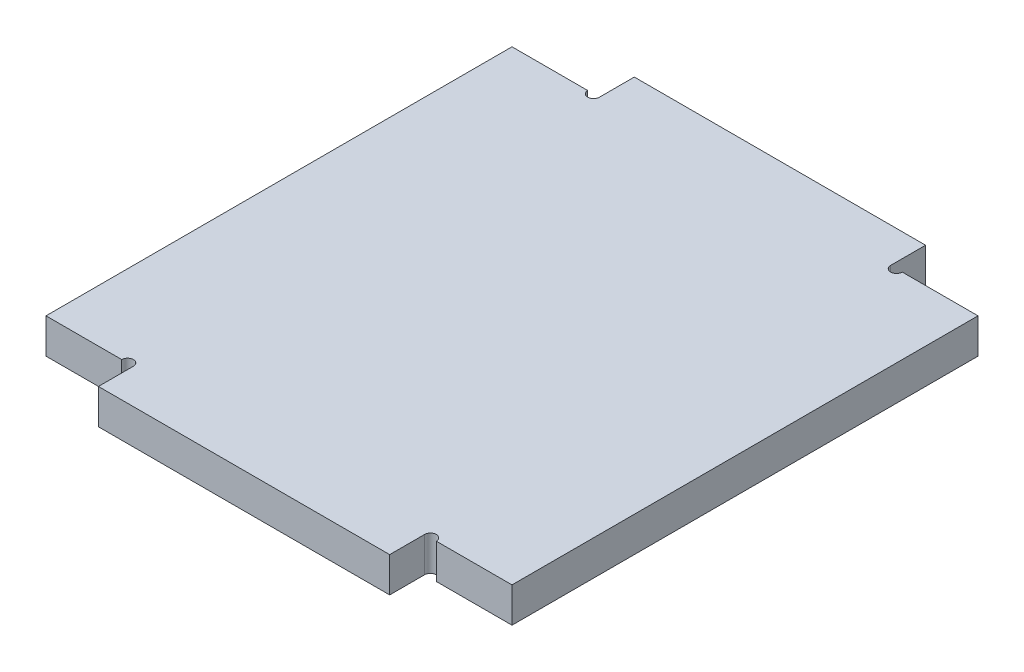
ISO-10303-21;
HEADER;
FILE_DESCRIPTION(('STEP AP214'),'2;1');
FILE_NAME('part.step','',(''),(''),'','','');
FILE_SCHEMA(('AUTOMOTIVE_DESIGN { 1 0 10303 214 1 1 1 1 }'));
ENDSEC;
DATA;
#1=APPLICATION_CONTEXT('core data for automotive mechanical design processes');
#2=APPLICATION_PROTOCOL_DEFINITION('international standard','automotive_design',2000,#1);
#3=PRODUCT_CONTEXT('',#1,'mechanical');
#4=PRODUCT('Part','Part','',(#3));
#5=PRODUCT_RELATED_PRODUCT_CATEGORY('part','',(#4));
#6=PRODUCT_DEFINITION_FORMATION('','',#4);
#7=PRODUCT_DEFINITION_CONTEXT('part definition',#1,'design');
#8=PRODUCT_DEFINITION('design','',#6,#7);
#9=PRODUCT_DEFINITION_SHAPE('','',#8);
#10=(LENGTH_UNIT() NAMED_UNIT(*) SI_UNIT(.MILLI.,.METRE.));
#11=(NAMED_UNIT(*) PLANE_ANGLE_UNIT() SI_UNIT($,.RADIAN.));
#12=(NAMED_UNIT(*) SI_UNIT($,.STERADIAN.) SOLID_ANGLE_UNIT());
#13=UNCERTAINTY_MEASURE_WITH_UNIT(LENGTH_MEASURE(1.E-05),#10,'distance_accuracy_value','');
#14=(GEOMETRIC_REPRESENTATION_CONTEXT(3) GLOBAL_UNCERTAINTY_ASSIGNED_CONTEXT((#13)) GLOBAL_UNIT_ASSIGNED_CONTEXT((#10,
#11,#12)) REPRESENTATION_CONTEXT('',''));
#15=CARTESIAN_POINT('',(0.,0.,0.));
#16=DIRECTION('',(0.,0.,1.));
#17=DIRECTION('',(1.,0.,0.));
#18=AXIS2_PLACEMENT_3D('',#15,#16,#17);
#19=CARTESIAN_POINT('',(0.,3.,0.));
#20=DIRECTION('',(1.,0.,0.));
#21=DIRECTION('',(0.,0.,-1.));
#22=AXIS2_PLACEMENT_3D('',#19,#20,#21);
#23=PLANE('',#22);
#24=DIRECTION('',(0.,0.,1.));
#25=VECTOR('',#24,1.);
#26=CARTESIAN_POINT('',(0.,0.,0.));
#27=LINE('',#26,#25);
#28=CARTESIAN_POINT('',(0.,0.,-40.));
#29=VERTEX_POINT('',#28);
#30=CARTESIAN_POINT('',(0.,0.,0.));
#31=VERTEX_POINT('',#30);
#32=EDGE_CURVE('E185',#29,#31,#27,.T.);
#33=ORIENTED_EDGE('',*,*,#32,.T.);
#34=DIRECTION('',(0.,-1.,0.));
#35=VECTOR('',#34,1.);
#36=CARTESIAN_POINT('',(0.,3.,0.));
#37=LINE('',#36,#35);
#38=CARTESIAN_POINT('',(0.,3.,0.));
#39=VERTEX_POINT('',#38);
#40=EDGE_CURVE('E11',#39,#31,#37,.T.);
#41=ORIENTED_EDGE('',*,*,#40,.F.);
#42=DIRECTION('',(0.,0.,1.));
#43=VECTOR('',#42,1.);
#44=CARTESIAN_POINT('',(0.,3.,0.));
#45=LINE('',#44,#43);
#46=CARTESIAN_POINT('',(0.,3.,-40.));
#47=VERTEX_POINT('',#46);
#48=EDGE_CURVE('E215',#47,#39,#45,.T.);
#49=ORIENTED_EDGE('',*,*,#48,.F.);
#50=DIRECTION('',(0.,-1.,0.));
#51=VECTOR('',#50,1.);
#52=CARTESIAN_POINT('',(0.,3.,-40.));
#53=LINE('',#52,#51);
#54=EDGE_CURVE('E181',#47,#29,#53,.T.);
#55=ORIENTED_EDGE('',*,*,#54,.T.);
#56=EDGE_LOOP('',(#33,#41,#49,#55));
#57=FACE_BOUND('',#56,.T.);
#58=ADVANCED_FACE('F41',(#57),#23,.F.);
#59=CARTESIAN_POINT('',(0.,3.,0.));
#60=DIRECTION('',(0.,0.,-1.));
#61=DIRECTION('',(-1.,0.,0.));
#62=AXIS2_PLACEMENT_3D('',#59,#60,#61);
#63=PLANE('',#62);
#64=DIRECTION('',(1.,0.,0.));
#65=VECTOR('',#64,1.);
#66=CARTESIAN_POINT('',(0.,0.,0.));
#67=LINE('',#66,#65);
#68=CARTESIAN_POINT('',(6.5,0.,0.));
#69=VERTEX_POINT('',#68);
#70=EDGE_CURVE('E188',#31,#69,#67,.T.);
#71=ORIENTED_EDGE('',*,*,#70,.T.);
#72=DIRECTION('',(0.,-1.,0.));
#73=VECTOR('',#72,1.);
#74=CARTESIAN_POINT('',(6.5,3.,0.));
#75=LINE('',#74,#73);
#76=CARTESIAN_POINT('',(6.5,3.,0.));
#77=VERTEX_POINT('',#76);
#78=EDGE_CURVE('E49',#77,#69,#75,.T.);
#79=ORIENTED_EDGE('',*,*,#78,.F.);
#80=DIRECTION('',(1.,0.,0.));
#81=VECTOR('',#80,1.);
#82=CARTESIAN_POINT('',(0.,3.,0.));
#83=LINE('',#82,#81);
#84=EDGE_CURVE('E124',#39,#77,#83,.T.);
#85=ORIENTED_EDGE('',*,*,#84,.F.);
#86=ORIENTED_EDGE('',*,*,#40,.T.);
#87=EDGE_LOOP('',(#71,#79,#85,#86));
#88=FACE_BOUND('',#87,.T.);
#89=ADVANCED_FACE('F313',(#88),#63,.F.);
#90=CARTESIAN_POINT('',(7.,3.,0.));
#91=DIRECTION('',(0.,-1.,0.));
#92=DIRECTION('',(0.,0.,-1.));
#93=AXIS2_PLACEMENT_3D('',#90,#91,#92);
#94=CYLINDRICAL_SURFACE('',#93,0.5);
#95=CARTESIAN_POINT('',(7.,0.,0.));
#96=DIRECTION('',(0.,-1.,0.));
#97=DIRECTION('',(0.,0.,-1.));
#98=AXIS2_PLACEMENT_3D('',#95,#96,#97);
#99=CIRCLE('',#98,0.5);
#100=CARTESIAN_POINT('',(7.5,0.,0.));
#101=VERTEX_POINT('',#100);
#102=EDGE_CURVE('E190',#69,#101,#99,.T.);
#103=ORIENTED_EDGE('',*,*,#102,.T.);
#104=DIRECTION('',(0.,-1.,0.));
#105=VECTOR('',#104,1.);
#106=CARTESIAN_POINT('',(7.5,3.,0.));
#107=LINE('',#106,#105);
#108=CARTESIAN_POINT('',(7.5,3.,0.));
#109=VERTEX_POINT('',#108);
#110=EDGE_CURVE('E246',#109,#101,#107,.T.);
#111=ORIENTED_EDGE('',*,*,#110,.F.);
#112=CARTESIAN_POINT('',(7.,3.,0.));
#113=DIRECTION('',(0.,-1.,0.));
#114=DIRECTION('',(0.,0.,-1.));
#115=AXIS2_PLACEMENT_3D('',#112,#113,#114);
#116=CIRCLE('',#115,0.5);
#117=EDGE_CURVE('E254',#77,#109,#116,.T.);
#118=ORIENTED_EDGE('',*,*,#117,.F.);
#119=ORIENTED_EDGE('',*,*,#78,.T.);
#120=EDGE_LOOP('',(#103,#111,#118,#119));
#121=FACE_BOUND('',#120,.T.);
#122=ADVANCED_FACE('F252',(#121),#94,.F.);
#123=CARTESIAN_POINT('',(7.5,3.,0.));
#124=DIRECTION('',(1.,0.,0.));
#125=DIRECTION('',(0.,0.,-1.));
#126=AXIS2_PLACEMENT_3D('',#123,#124,#125);
#127=PLANE('',#126);
#128=DIRECTION('',(0.,0.,1.));
#129=VECTOR('',#128,1.);
#130=CARTESIAN_POINT('',(7.5,0.,0.));
#131=LINE('',#130,#129);
#132=CARTESIAN_POINT('',(7.5,0.,3.));
#133=VERTEX_POINT('',#132);
#134=EDGE_CURVE('E192',#101,#133,#131,.T.);
#135=ORIENTED_EDGE('',*,*,#134,.T.);
#136=DIRECTION('',(0.,-1.,0.));
#137=VECTOR('',#136,1.);
#138=CARTESIAN_POINT('',(7.5,3.,3.));
#139=LINE('',#138,#137);
#140=CARTESIAN_POINT('',(7.5,3.,3.));
#141=VERTEX_POINT('',#140);
#142=EDGE_CURVE('E243',#141,#133,#139,.T.);
#143=ORIENTED_EDGE('',*,*,#142,.F.);
#144=DIRECTION('',(0.,0.,1.));
#145=VECTOR('',#144,1.);
#146=CARTESIAN_POINT('',(7.5,3.,0.));
#147=LINE('',#146,#145);
#148=EDGE_CURVE('E272',#109,#141,#147,.T.);
#149=ORIENTED_EDGE('',*,*,#148,.F.);
#150=ORIENTED_EDGE('',*,*,#110,.T.);
#151=EDGE_LOOP('',(#135,#143,#149,#150));
#152=FACE_BOUND('',#151,.T.);
#153=ADVANCED_FACE('F263',(#152),#127,.F.);
#154=CARTESIAN_POINT('',(7.5,3.,3.));
#155=DIRECTION('',(0.,0.,-1.));
#156=DIRECTION('',(-1.,0.,0.));
#157=AXIS2_PLACEMENT_3D('',#154,#155,#156);
#158=PLANE('',#157);
#159=DIRECTION('',(1.,0.,0.));
#160=VECTOR('',#159,1.);
#161=CARTESIAN_POINT('',(7.5,0.,3.));
#162=LINE('',#161,#160);
#163=CARTESIAN_POINT('',(32.5,0.,3.));
#164=VERTEX_POINT('',#163);
#165=EDGE_CURVE('E194',#133,#164,#162,.T.);
#166=ORIENTED_EDGE('',*,*,#165,.T.);
#167=DIRECTION('',(0.,-1.,0.));
#168=VECTOR('',#167,1.);
#169=CARTESIAN_POINT('',(32.5,3.,3.));
#170=LINE('',#169,#168);
#171=CARTESIAN_POINT('',(32.5,3.,3.));
#172=VERTEX_POINT('',#171);
#173=EDGE_CURVE('E240',#172,#164,#170,.T.);
#174=ORIENTED_EDGE('',*,*,#173,.F.);
#175=DIRECTION('',(1.,0.,0.));
#176=VECTOR('',#175,1.);
#177=CARTESIAN_POINT('',(7.5,3.,3.));
#178=LINE('',#177,#176);
#179=EDGE_CURVE('E269',#141,#172,#178,.T.);
#180=ORIENTED_EDGE('',*,*,#179,.F.);
#181=ORIENTED_EDGE('',*,*,#142,.T.);
#182=EDGE_LOOP('',(#166,#174,#180,#181));
#183=FACE_BOUND('',#182,.T.);
#184=ADVANCED_FACE('F267',(#183),#158,.F.);
#185=CARTESIAN_POINT('',(32.5,3.,0.));
#186=DIRECTION('',(-1.,0.,0.));
#187=DIRECTION('',(0.,0.,1.));
#188=AXIS2_PLACEMENT_3D('',#185,#186,#187);
#189=PLANE('',#188);
#190=DIRECTION('',(0.,0.,-1.));
#191=VECTOR('',#190,1.);
#192=CARTESIAN_POINT('',(32.5,0.,0.));
#193=LINE('',#192,#191);
#194=CARTESIAN_POINT('',(32.5,0.,0.));
#195=VERTEX_POINT('',#194);
#196=EDGE_CURVE('E196',#164,#195,#193,.T.);
#197=ORIENTED_EDGE('',*,*,#196,.T.);
#198=DIRECTION('',(0.,-1.,0.));
#199=VECTOR('',#198,1.);
#200=CARTESIAN_POINT('',(32.5,3.,0.));
#201=LINE('',#200,#199);
#202=CARTESIAN_POINT('',(32.5,3.,0.));
#203=VERTEX_POINT('',#202);
#204=EDGE_CURVE('E237',#203,#195,#201,.T.);
#205=ORIENTED_EDGE('',*,*,#204,.F.);
#206=DIRECTION('',(0.,0.,-1.));
#207=VECTOR('',#206,1.);
#208=CARTESIAN_POINT('',(32.5,3.,0.));
#209=LINE('',#208,#207);
#210=EDGE_CURVE('E271',#172,#203,#209,.T.);
#211=ORIENTED_EDGE('',*,*,#210,.F.);
#212=ORIENTED_EDGE('',*,*,#173,.T.);
#213=EDGE_LOOP('',(#197,#205,#211,#212));
#214=FACE_BOUND('',#213,.T.);
#215=ADVANCED_FACE('F326',(#214),#189,.F.);
#216=CARTESIAN_POINT('',(33.,3.,0.));
#217=DIRECTION('',(0.,-1.,0.));
#218=DIRECTION('',(0.,0.,-1.));
#219=AXIS2_PLACEMENT_3D('',#216,#217,#218);
#220=CYLINDRICAL_SURFACE('',#219,0.5);
#221=CARTESIAN_POINT('',(33.,0.,0.));
#222=DIRECTION('',(0.,-1.,0.));
#223=DIRECTION('',(0.,0.,-1.));
#224=AXIS2_PLACEMENT_3D('',#221,#222,#223);
#225=CIRCLE('',#224,0.5);
#226=CARTESIAN_POINT('',(33.5,0.,0.));
#227=VERTEX_POINT('',#226);
#228=EDGE_CURVE('E198',#195,#227,#225,.T.);
#229=ORIENTED_EDGE('',*,*,#228,.T.);
#230=DIRECTION('',(0.,-1.,0.));
#231=VECTOR('',#230,1.);
#232=CARTESIAN_POINT('',(33.5,3.,0.));
#233=LINE('',#232,#231);
#234=CARTESIAN_POINT('',(33.5,3.,0.));
#235=VERTEX_POINT('',#234);
#236=EDGE_CURVE('E234',#235,#227,#233,.T.);
#237=ORIENTED_EDGE('',*,*,#236,.F.);
#238=CARTESIAN_POINT('',(33.,3.,0.));
#239=DIRECTION('',(0.,-1.,0.));
#240=DIRECTION('',(0.,0.,-1.));
#241=AXIS2_PLACEMENT_3D('',#238,#239,#240);
#242=CIRCLE('',#241,0.5);
#243=EDGE_CURVE('E274',#203,#235,#242,.T.);
#244=ORIENTED_EDGE('',*,*,#243,.F.);
#245=ORIENTED_EDGE('',*,*,#204,.T.);
#246=EDGE_LOOP('',(#229,#237,#244,#245));
#247=FACE_BOUND('',#246,.T.);
#248=ADVANCED_FACE('F329',(#247),#220,.F.);
#249=CARTESIAN_POINT('',(33.5,3.,0.));
#250=DIRECTION('',(0.,0.,-1.));
#251=DIRECTION('',(-1.,0.,0.));
#252=AXIS2_PLACEMENT_3D('',#249,#250,#251);
#253=PLANE('',#252);
#254=DIRECTION('',(1.,0.,0.));
#255=VECTOR('',#254,1.);
#256=CARTESIAN_POINT('',(33.5,0.,0.));
#257=LINE('',#256,#255);
#258=CARTESIAN_POINT('',(40.,0.,0.));
#259=VERTEX_POINT('',#258);
#260=EDGE_CURVE('E200',#227,#259,#257,.T.);
#261=ORIENTED_EDGE('',*,*,#260,.T.);
#262=DIRECTION('',(0.,-1.,0.));
#263=VECTOR('',#262,1.);
#264=CARTESIAN_POINT('',(40.,3.,0.));
#265=LINE('',#264,#263);
#266=CARTESIAN_POINT('',(40.,3.,0.));
#267=VERTEX_POINT('',#266);
#268=EDGE_CURVE('E231',#267,#259,#265,.T.);
#269=ORIENTED_EDGE('',*,*,#268,.F.);
#270=DIRECTION('',(1.,0.,0.));
#271=VECTOR('',#270,1.);
#272=CARTESIAN_POINT('',(33.5,3.,0.));
#273=LINE('',#272,#271);
#274=EDGE_CURVE('E280',#235,#267,#273,.T.);
#275=ORIENTED_EDGE('',*,*,#274,.F.);
#276=ORIENTED_EDGE('',*,*,#236,.T.);
#277=EDGE_LOOP('',(#261,#269,#275,#276));
#278=FACE_BOUND('',#277,.T.);
#279=ADVANCED_FACE('F333',(#278),#253,.F.);
#280=CARTESIAN_POINT('',(40.,3.,0.));
#281=DIRECTION('',(-1.,0.,0.));
#282=DIRECTION('',(0.,0.,1.));
#283=AXIS2_PLACEMENT_3D('',#280,#281,#282);
#284=PLANE('',#283);
#285=DIRECTION('',(0.,0.,-1.));
#286=VECTOR('',#285,1.);
#287=CARTESIAN_POINT('',(40.,0.,0.));
#288=LINE('',#287,#286);
#289=CARTESIAN_POINT('',(40.,0.,-40.));
#290=VERTEX_POINT('',#289);
#291=EDGE_CURVE('E202',#259,#290,#288,.T.);
#292=ORIENTED_EDGE('',*,*,#291,.T.);
#293=DIRECTION('',(0.,-1.,0.));
#294=VECTOR('',#293,1.);
#295=CARTESIAN_POINT('',(40.,3.,-40.));
#296=LINE('',#295,#294);
#297=CARTESIAN_POINT('',(40.,3.,-40.));
#298=VERTEX_POINT('',#297);
#299=EDGE_CURVE('E228',#298,#290,#296,.T.);
#300=ORIENTED_EDGE('',*,*,#299,.F.);
#301=DIRECTION('',(0.,0.,-1.));
#302=VECTOR('',#301,1.);
#303=CARTESIAN_POINT('',(40.,3.,0.));
#304=LINE('',#303,#302);
#305=EDGE_CURVE('E282',#267,#298,#304,.T.);
#306=ORIENTED_EDGE('',*,*,#305,.F.);
#307=ORIENTED_EDGE('',*,*,#268,.T.);
#308=EDGE_LOOP('',(#292,#300,#306,#307));
#309=FACE_BOUND('',#308,.T.);
#310=ADVANCED_FACE('F337',(#309),#284,.F.);
#311=CARTESIAN_POINT('',(33.5,3.,-40.));
#312=DIRECTION('',(0.,0.,1.));
#313=DIRECTION('',(1.,0.,0.));
#314=AXIS2_PLACEMENT_3D('',#311,#312,#313);
#315=PLANE('',#314);
#316=DIRECTION('',(-1.,0.,0.));
#317=VECTOR('',#316,1.);
#318=CARTESIAN_POINT('',(33.5,0.,-40.));
#319=LINE('',#318,#317);
#320=CARTESIAN_POINT('',(33.5,0.,-40.));
#321=VERTEX_POINT('',#320);
#322=EDGE_CURVE('E204',#290,#321,#319,.T.);
#323=ORIENTED_EDGE('',*,*,#322,.T.);
#324=DIRECTION('',(0.,-1.,0.));
#325=VECTOR('',#324,1.);
#326=CARTESIAN_POINT('',(33.5,3.,-40.));
#327=LINE('',#326,#325);
#328=CARTESIAN_POINT('',(33.5,3.,-40.));
#329=VERTEX_POINT('',#328);
#330=EDGE_CURVE('E225',#329,#321,#327,.T.);
#331=ORIENTED_EDGE('',*,*,#330,.F.);
#332=DIRECTION('',(-1.,0.,0.));
#333=VECTOR('',#332,1.);
#334=CARTESIAN_POINT('',(33.5,3.,-40.));
#335=LINE('',#334,#333);
#336=EDGE_CURVE('E284',#298,#329,#335,.T.);
#337=ORIENTED_EDGE('',*,*,#336,.F.);
#338=ORIENTED_EDGE('',*,*,#299,.T.);
#339=EDGE_LOOP('',(#323,#331,#337,#338));
#340=FACE_BOUND('',#339,.T.);
#341=ADVANCED_FACE('F341',(#340),#315,.F.);
#342=CARTESIAN_POINT('',(33.,3.,-40.));
#343=DIRECTION('',(0.,-1.,0.));
#344=DIRECTION('',(0.,0.,-1.));
#345=AXIS2_PLACEMENT_3D('',#342,#343,#344);
#346=CYLINDRICAL_SURFACE('',#345,0.5);
#347=CARTESIAN_POINT('',(33.,0.,-40.));
#348=DIRECTION('',(0.,-1.,0.));
#349=DIRECTION('',(0.,0.,1.));
#350=AXIS2_PLACEMENT_3D('',#347,#348,#349);
#351=CIRCLE('',#350,0.5);
#352=CARTESIAN_POINT('',(32.5,0.,-40.));
#353=VERTEX_POINT('',#352);
#354=EDGE_CURVE('E206',#321,#353,#351,.T.);
#355=ORIENTED_EDGE('',*,*,#354,.T.);
#356=DIRECTION('',(0.,-1.,0.));
#357=VECTOR('',#356,1.);
#358=CARTESIAN_POINT('',(32.5,3.,-40.));
#359=LINE('',#358,#357);
#360=CARTESIAN_POINT('',(32.5,3.,-40.));
#361=VERTEX_POINT('',#360);
#362=EDGE_CURVE('E222',#361,#353,#359,.T.);
#363=ORIENTED_EDGE('',*,*,#362,.F.);
#364=CARTESIAN_POINT('',(33.,3.,-40.));
#365=DIRECTION('',(0.,-1.,0.));
#366=DIRECTION('',(0.,0.,1.));
#367=AXIS2_PLACEMENT_3D('',#364,#365,#366);
#368=CIRCLE('',#367,0.5);
#369=EDGE_CURVE('E286',#329,#361,#368,.T.);
#370=ORIENTED_EDGE('',*,*,#369,.F.);
#371=ORIENTED_EDGE('',*,*,#330,.T.);
#372=EDGE_LOOP('',(#355,#363,#370,#371));
#373=FACE_BOUND('',#372,.T.);
#374=ADVANCED_FACE('F345',(#373),#346,.F.);
#375=CARTESIAN_POINT('',(32.5,3.,-40.));
#376=DIRECTION('',(-1.,0.,0.));
#377=DIRECTION('',(0.,0.,1.));
#378=AXIS2_PLACEMENT_3D('',#375,#376,#377);
#379=PLANE('',#378);
#380=DIRECTION('',(0.,0.,-1.));
#381=VECTOR('',#380,1.);
#382=CARTESIAN_POINT('',(32.5,0.,-40.));
#383=LINE('',#382,#381);
#384=CARTESIAN_POINT('',(32.5,0.,-43.));
#385=VERTEX_POINT('',#384);
#386=EDGE_CURVE('E208',#353,#385,#383,.T.);
#387=ORIENTED_EDGE('',*,*,#386,.T.);
#388=DIRECTION('',(0.,-1.,0.));
#389=VECTOR('',#388,1.);
#390=CARTESIAN_POINT('',(32.5,3.,-43.));
#391=LINE('',#390,#389);
#392=CARTESIAN_POINT('',(32.5,3.,-43.));
#393=VERTEX_POINT('',#392);
#394=EDGE_CURVE('E219',#393,#385,#391,.T.);
#395=ORIENTED_EDGE('',*,*,#394,.F.);
#396=DIRECTION('',(0.,0.,-1.));
#397=VECTOR('',#396,1.);
#398=CARTESIAN_POINT('',(32.5,3.,-40.));
#399=LINE('',#398,#397);
#400=EDGE_CURVE('E288',#361,#393,#399,.T.);
#401=ORIENTED_EDGE('',*,*,#400,.F.);
#402=ORIENTED_EDGE('',*,*,#362,.T.);
#403=EDGE_LOOP('',(#387,#395,#401,#402));
#404=FACE_BOUND('',#403,.T.);
#405=ADVANCED_FACE('F294',(#404),#379,.F.);
#406=CARTESIAN_POINT('',(7.5,3.,-43.));
#407=DIRECTION('',(0.,0.,1.));
#408=DIRECTION('',(1.,0.,0.));
#409=AXIS2_PLACEMENT_3D('',#406,#407,#408);
#410=PLANE('',#409);
#411=DIRECTION('',(-1.,0.,0.));
#412=VECTOR('',#411,1.);
#413=CARTESIAN_POINT('',(7.5,0.,-43.));
#414=LINE('',#413,#412);
#415=CARTESIAN_POINT('',(7.5,0.,-43.));
#416=VERTEX_POINT('',#415);
#417=EDGE_CURVE('E210',#385,#416,#414,.T.);
#418=ORIENTED_EDGE('',*,*,#417,.T.);
#419=DIRECTION('',(0.,-1.,0.));
#420=VECTOR('',#419,1.);
#421=CARTESIAN_POINT('',(7.5,3.,-43.));
#422=LINE('',#421,#420);
#423=CARTESIAN_POINT('',(7.5,3.,-43.));
#424=VERTEX_POINT('',#423);
#425=EDGE_CURVE('E176',#424,#416,#422,.T.);
#426=ORIENTED_EDGE('',*,*,#425,.F.);
#427=DIRECTION('',(-1.,0.,0.));
#428=VECTOR('',#427,1.);
#429=CARTESIAN_POINT('',(7.5,3.,-43.));
#430=LINE('',#429,#428);
#431=EDGE_CURVE('E167',#393,#424,#430,.T.);
#432=ORIENTED_EDGE('',*,*,#431,.F.);
#433=ORIENTED_EDGE('',*,*,#394,.T.);
#434=EDGE_LOOP('',(#418,#426,#432,#433));
#435=FACE_BOUND('',#434,.T.);
#436=ADVANCED_FACE('F298',(#435),#410,.F.);
#437=CARTESIAN_POINT('',(7.5,3.,-40.));
#438=DIRECTION('',(1.,0.,0.));
#439=DIRECTION('',(0.,0.,-1.));
#440=AXIS2_PLACEMENT_3D('',#437,#438,#439);
#441=PLANE('',#440);
#442=DIRECTION('',(0.,0.,1.));
#443=VECTOR('',#442,1.);
#444=CARTESIAN_POINT('',(7.5,0.,-40.));
#445=LINE('',#444,#443);
#446=CARTESIAN_POINT('',(7.5,0.,-40.));
#447=VERTEX_POINT('',#446);
#448=EDGE_CURVE('E175',#416,#447,#445,.T.);
#449=ORIENTED_EDGE('',*,*,#448,.T.);
#450=DIRECTION('',(0.,-1.,0.));
#451=VECTOR('',#450,1.);
#452=CARTESIAN_POINT('',(7.5,3.,-40.));
#453=LINE('',#452,#451);
#454=CARTESIAN_POINT('',(7.5,3.,-40.));
#455=VERTEX_POINT('',#454);
#456=EDGE_CURVE('E172',#455,#447,#453,.T.);
#457=ORIENTED_EDGE('',*,*,#456,.F.);
#458=DIRECTION('',(0.,0.,1.));
#459=VECTOR('',#458,1.);
#460=CARTESIAN_POINT('',(7.5,3.,-40.));
#461=LINE('',#460,#459);
#462=EDGE_CURVE('E161',#424,#455,#461,.T.);
#463=ORIENTED_EDGE('',*,*,#462,.F.);
#464=ORIENTED_EDGE('',*,*,#425,.T.);
#465=EDGE_LOOP('',(#449,#457,#463,#464));
#466=FACE_BOUND('',#465,.T.);
#467=ADVANCED_FACE('F173',(#466),#441,.F.);
#468=CARTESIAN_POINT('',(7.,3.,-40.));
#469=DIRECTION('',(0.,-1.,0.));
#470=DIRECTION('',(0.,0.,-1.));
#471=AXIS2_PLACEMENT_3D('',#468,#469,#470);
#472=CYLINDRICAL_SURFACE('',#471,0.5);
#473=CARTESIAN_POINT('',(7.,0.,-40.));
#474=DIRECTION('',(0.,-1.,0.));
#475=DIRECTION('',(0.,0.,1.));
#476=AXIS2_PLACEMENT_3D('',#473,#474,#475);
#477=CIRCLE('',#476,0.5);
#478=CARTESIAN_POINT('',(6.5,0.,-40.));
#479=VERTEX_POINT('',#478);
#480=EDGE_CURVE('E110',#447,#479,#477,.T.);
#481=ORIENTED_EDGE('',*,*,#480,.T.);
#482=DIRECTION('',(0.,-1.,0.));
#483=VECTOR('',#482,1.);
#484=CARTESIAN_POINT('',(6.5,3.,-40.));
#485=LINE('',#484,#483);
#486=CARTESIAN_POINT('',(6.5,3.,-40.));
#487=VERTEX_POINT('',#486);
#488=EDGE_CURVE('E177',#487,#479,#485,.T.);
#489=ORIENTED_EDGE('',*,*,#488,.F.);
#490=CARTESIAN_POINT('',(7.,3.,-40.));
#491=DIRECTION('',(0.,-1.,0.));
#492=DIRECTION('',(0.,0.,1.));
#493=AXIS2_PLACEMENT_3D('',#490,#491,#492);
#494=CIRCLE('',#493,0.5);
#495=EDGE_CURVE('E165',#455,#487,#494,.T.);
#496=ORIENTED_EDGE('',*,*,#495,.F.);
#497=ORIENTED_EDGE('',*,*,#456,.T.);
#498=EDGE_LOOP('',(#481,#489,#496,#497));
#499=FACE_BOUND('',#498,.T.);
#500=ADVANCED_FACE('F179',(#499),#472,.F.);
#501=CARTESIAN_POINT('',(0.,3.,-40.));
#502=DIRECTION('',(0.,0.,1.));
#503=DIRECTION('',(1.,0.,0.));
#504=AXIS2_PLACEMENT_3D('',#501,#502,#503);
#505=PLANE('',#504);
#506=DIRECTION('',(-1.,0.,0.));
#507=VECTOR('',#506,1.);
#508=CARTESIAN_POINT('',(0.,0.,-40.));
#509=LINE('',#508,#507);
#510=EDGE_CURVE('E116',#479,#29,#509,.T.);
#511=ORIENTED_EDGE('',*,*,#510,.T.);
#512=ORIENTED_EDGE('',*,*,#54,.F.);
#513=DIRECTION('',(-1.,0.,0.));
#514=VECTOR('',#513,1.);
#515=CARTESIAN_POINT('',(0.,3.,-40.));
#516=LINE('',#515,#514);
#517=EDGE_CURVE('E57',#487,#47,#516,.T.);
#518=ORIENTED_EDGE('',*,*,#517,.F.);
#519=ORIENTED_EDGE('',*,*,#488,.T.);
#520=EDGE_LOOP('',(#511,#512,#518,#519));
#521=FACE_BOUND('',#520,.T.);
#522=ADVANCED_FACE('F302',(#521),#505,.F.);
#523=CARTESIAN_POINT('',(7.,3.,-40.));
#524=DIRECTION('',(0.,1.,0.));
#525=DIRECTION('',(0.,0.,1.));
#526=AXIS2_PLACEMENT_3D('',#523,#524,#525);
#527=PLANE('',#526);
#528=ORIENTED_EDGE('',*,*,#48,.T.);
#529=ORIENTED_EDGE('',*,*,#84,.T.);
#530=ORIENTED_EDGE('',*,*,#117,.T.);
#531=ORIENTED_EDGE('',*,*,#148,.T.);
#532=ORIENTED_EDGE('',*,*,#179,.T.);
#533=ORIENTED_EDGE('',*,*,#210,.T.);
#534=ORIENTED_EDGE('',*,*,#243,.T.);
#535=ORIENTED_EDGE('',*,*,#274,.T.);
#536=ORIENTED_EDGE('',*,*,#305,.T.);
#537=ORIENTED_EDGE('',*,*,#336,.T.);
#538=ORIENTED_EDGE('',*,*,#369,.T.);
#539=ORIENTED_EDGE('',*,*,#400,.T.);
#540=ORIENTED_EDGE('',*,*,#431,.T.);
#541=ORIENTED_EDGE('',*,*,#462,.T.);
#542=ORIENTED_EDGE('',*,*,#495,.T.);
#543=ORIENTED_EDGE('',*,*,#517,.T.);
#544=EDGE_LOOP('',(#528,#529,#530,#531,#532,#533,#534,#535,#536,#537,#538,#539,#540,#541,#542,#543));
#545=FACE_BOUND('',#544,.T.);
#546=ADVANCED_FACE('F163',(#545),#527,.T.);
#547=CARTESIAN_POINT('',(7.,0.,-40.));
#548=DIRECTION('',(0.,1.,0.));
#549=DIRECTION('',(0.,0.,1.));
#550=AXIS2_PLACEMENT_3D('',#547,#548,#549);
#551=PLANE('',#550);
#552=ORIENTED_EDGE('',*,*,#32,.F.);
#553=ORIENTED_EDGE('',*,*,#510,.F.);
#554=ORIENTED_EDGE('',*,*,#480,.F.);
#555=ORIENTED_EDGE('',*,*,#448,.F.);
#556=ORIENTED_EDGE('',*,*,#417,.F.);
#557=ORIENTED_EDGE('',*,*,#386,.F.);
#558=ORIENTED_EDGE('',*,*,#354,.F.);
#559=ORIENTED_EDGE('',*,*,#322,.F.);
#560=ORIENTED_EDGE('',*,*,#291,.F.);
#561=ORIENTED_EDGE('',*,*,#260,.F.);
#562=ORIENTED_EDGE('',*,*,#228,.F.);
#563=ORIENTED_EDGE('',*,*,#196,.F.);
#564=ORIENTED_EDGE('',*,*,#165,.F.);
#565=ORIENTED_EDGE('',*,*,#134,.F.);
#566=ORIENTED_EDGE('',*,*,#102,.F.);
#567=ORIENTED_EDGE('',*,*,#70,.F.);
#568=EDGE_LOOP('',(#552,#553,#554,#555,#556,#557,#558,#559,#560,#561,#562,#563,#564,#565,#566,#567));
#569=FACE_BOUND('',#568,.T.);
#570=ADVANCED_FACE('F258',(#569),#551,.F.);
#571=CLOSED_SHELL('',(#58,#89,#122,#153,#184,#215,#248,#279,#310,#341,#374,#405,#436,#467,#500,
#522,#546,#570));
#572=MANIFOLD_SOLID_BREP('B2',#571);
#573=ADVANCED_BREP_SHAPE_REPRESENTATION('',(#18,#572),#14);
#574=SHAPE_DEFINITION_REPRESENTATION(#9,#573);
ENDSEC;
END-ISO-10303-21;
